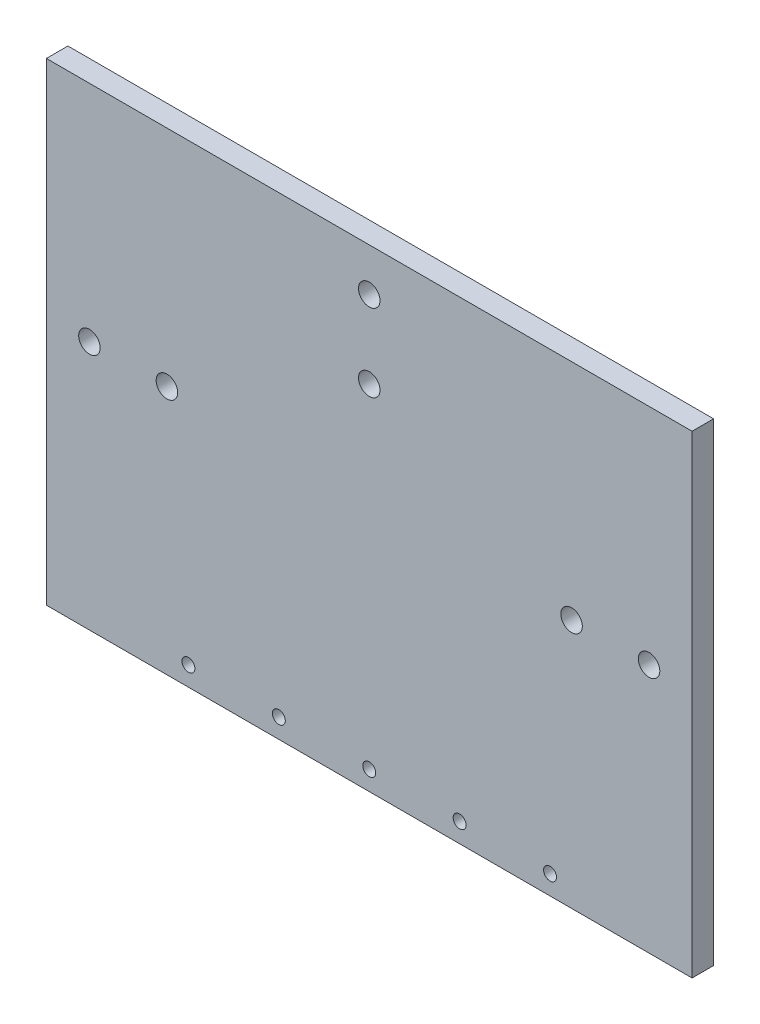
ISO-10303-21;
HEADER;
FILE_DESCRIPTION(('STEP AP214'),'2;1');
FILE_NAME('part.step','',(''),(''),'','','');
FILE_SCHEMA(('AUTOMOTIVE_DESIGN { 1 0 10303 214 1 1 1 1 }'));
ENDSEC;
DATA;
#1=APPLICATION_CONTEXT('core data for automotive mechanical design processes');
#2=APPLICATION_PROTOCOL_DEFINITION('international standard','automotive_design',2000,#1);
#3=PRODUCT_CONTEXT('',#1,'mechanical');
#4=PRODUCT('Part','Part','',(#3));
#5=PRODUCT_RELATED_PRODUCT_CATEGORY('part','',(#4));
#6=PRODUCT_DEFINITION_FORMATION('','',#4);
#7=PRODUCT_DEFINITION_CONTEXT('part definition',#1,'design');
#8=PRODUCT_DEFINITION('design','',#6,#7);
#9=PRODUCT_DEFINITION_SHAPE('','',#8);
#10=(LENGTH_UNIT() NAMED_UNIT(*) SI_UNIT(.MILLI.,.METRE.));
#11=(NAMED_UNIT(*) PLANE_ANGLE_UNIT() SI_UNIT($,.RADIAN.));
#12=(NAMED_UNIT(*) SI_UNIT($,.STERADIAN.) SOLID_ANGLE_UNIT());
#13=UNCERTAINTY_MEASURE_WITH_UNIT(LENGTH_MEASURE(1.E-05),#10,'distance_accuracy_value','');
#14=(GEOMETRIC_REPRESENTATION_CONTEXT(3) GLOBAL_UNCERTAINTY_ASSIGNED_CONTEXT((#13)) GLOBAL_UNIT_ASSIGNED_CONTEXT((#10,
#11,#12)) REPRESENTATION_CONTEXT('',''));
#15=CARTESIAN_POINT('',(0.,0.,0.));
#16=DIRECTION('',(0.,0.,1.));
#17=DIRECTION('',(1.,0.,0.));
#18=AXIS2_PLACEMENT_3D('',#15,#16,#17);
#19=CARTESIAN_POINT('',(-42.,-50.5,-0.00100000000000013));
#20=DIRECTION('',(0.,0.,1.));
#21=DIRECTION('',(1.,0.,0.));
#22=AXIS2_PLACEMENT_3D('',#19,#20,#21);
#23=CYLINDRICAL_SURFACE('',#22,1.5);
#24=CARTESIAN_POINT('',(-42.,-50.5,5.));
#25=DIRECTION('',(0.,0.,1.));
#26=DIRECTION('',(1.,0.,0.));
#27=AXIS2_PLACEMENT_3D('',#24,#25,#26);
#28=CIRCLE('',#27,1.5);
#29=CARTESIAN_POINT('',(-40.5,-50.5,5.));
#30=VERTEX_POINT('',#29);
#31=EDGE_CURVE('E46',#30,#30,#28,.T.);
#32=ORIENTED_EDGE('',*,*,#31,.T.);
#33=EDGE_LOOP('',(#32));
#34=FACE_BOUND('',#33,.T.);
#35=CARTESIAN_POINT('',(-42.,-50.5,0.));
#36=DIRECTION('',(0.,0.,1.));
#37=DIRECTION('',(1.,0.,0.));
#38=AXIS2_PLACEMENT_3D('',#35,#36,#37);
#39=CIRCLE('',#38,1.5);
#40=CARTESIAN_POINT('',(-40.5,-50.5,0.));
#41=VERTEX_POINT('',#40);
#42=EDGE_CURVE('E11',#41,#41,#39,.F.);
#43=ORIENTED_EDGE('',*,*,#42,.T.);
#44=EDGE_LOOP('',(#43));
#45=FACE_BOUND('',#44,.T.);
#46=ADVANCED_FACE('F38',(#34,#45),#23,.F.);
#47=CARTESIAN_POINT('',(-21.,-50.5,-0.00100000000000013));
#48=DIRECTION('',(0.,0.,1.));
#49=DIRECTION('',(1.,0.,0.));
#50=AXIS2_PLACEMENT_3D('',#47,#48,#49);
#51=CYLINDRICAL_SURFACE('',#50,1.5);
#52=CARTESIAN_POINT('',(-21.,-50.5,5.));
#53=DIRECTION('',(0.,0.,1.));
#54=DIRECTION('',(1.,0.,0.));
#55=AXIS2_PLACEMENT_3D('',#52,#53,#54);
#56=CIRCLE('',#55,1.5);
#57=CARTESIAN_POINT('',(-19.5,-50.5,5.));
#58=VERTEX_POINT('',#57);
#59=EDGE_CURVE('E122',#58,#58,#56,.T.);
#60=ORIENTED_EDGE('',*,*,#59,.T.);
#61=EDGE_LOOP('',(#60));
#62=FACE_BOUND('',#61,.T.);
#63=CARTESIAN_POINT('',(-21.,-50.5,0.));
#64=DIRECTION('',(0.,0.,1.));
#65=DIRECTION('',(1.,0.,0.));
#66=AXIS2_PLACEMENT_3D('',#63,#64,#65);
#67=CIRCLE('',#66,1.5);
#68=CARTESIAN_POINT('',(-19.5,-50.5,0.));
#69=VERTEX_POINT('',#68);
#70=EDGE_CURVE('E125',#69,#69,#67,.F.);
#71=ORIENTED_EDGE('',*,*,#70,.T.);
#72=EDGE_LOOP('',(#71));
#73=FACE_BOUND('',#72,.T.);
#74=ADVANCED_FACE('F149',(#62,#73),#51,.F.);
#75=CARTESIAN_POINT('',(0.,-50.5,-0.00100000000000013));
#76=DIRECTION('',(0.,0.,1.));
#77=DIRECTION('',(1.,0.,0.));
#78=AXIS2_PLACEMENT_3D('',#75,#76,#77);
#79=CYLINDRICAL_SURFACE('',#78,1.5);
#80=CARTESIAN_POINT('',(0.,-50.5,5.));
#81=DIRECTION('',(0.,0.,1.));
#82=DIRECTION('',(1.,0.,0.));
#83=AXIS2_PLACEMENT_3D('',#80,#81,#82);
#84=CIRCLE('',#83,1.5);
#85=CARTESIAN_POINT('',(1.50000000000001,-50.5,5.));
#86=VERTEX_POINT('',#85);
#87=EDGE_CURVE('E116',#86,#86,#84,.T.);
#88=ORIENTED_EDGE('',*,*,#87,.T.);
#89=EDGE_LOOP('',(#88));
#90=FACE_BOUND('',#89,.T.);
#91=CARTESIAN_POINT('',(0.,-50.5,0.));
#92=DIRECTION('',(0.,0.,1.));
#93=DIRECTION('',(1.,0.,0.));
#94=AXIS2_PLACEMENT_3D('',#91,#92,#93);
#95=CIRCLE('',#94,1.5);
#96=CARTESIAN_POINT('',(1.50000000000001,-50.5,0.));
#97=VERTEX_POINT('',#96);
#98=EDGE_CURVE('E119',#97,#97,#95,.F.);
#99=ORIENTED_EDGE('',*,*,#98,.T.);
#100=EDGE_LOOP('',(#99));
#101=FACE_BOUND('',#100,.T.);
#102=ADVANCED_FACE('F153',(#90,#101),#79,.F.);
#103=CARTESIAN_POINT('',(75.,55.,5.));
#104=DIRECTION('',(-1.,0.,0.));
#105=DIRECTION('',(0.,-1.,0.));
#106=AXIS2_PLACEMENT_3D('',#103,#104,#105);
#107=PLANE('',#106);
#108=DIRECTION('',(0.,1.,0.));
#109=VECTOR('',#108,1.);
#110=CARTESIAN_POINT('',(75.,55.,0.));
#111=LINE('',#110,#109);
#112=CARTESIAN_POINT('',(75.,-55.,0.));
#113=VERTEX_POINT('',#112);
#114=CARTESIAN_POINT('',(75.,55.,0.));
#115=VERTEX_POINT('',#114);
#116=EDGE_CURVE('E106',#113,#115,#111,.T.);
#117=ORIENTED_EDGE('',*,*,#116,.T.);
#118=DIRECTION('',(0.,0.,-1.));
#119=VECTOR('',#118,1.);
#120=CARTESIAN_POINT('',(75.,55.,5.));
#121=LINE('',#120,#119);
#122=CARTESIAN_POINT('',(75.,55.,5.));
#123=VERTEX_POINT('',#122);
#124=EDGE_CURVE('E97',#123,#115,#121,.T.);
#125=ORIENTED_EDGE('',*,*,#124,.F.);
#126=DIRECTION('',(0.,1.,0.));
#127=VECTOR('',#126,1.);
#128=CARTESIAN_POINT('',(75.,55.,5.));
#129=LINE('',#128,#127);
#130=CARTESIAN_POINT('',(75.,-55.,5.));
#131=VERTEX_POINT('',#130);
#132=EDGE_CURVE('E91',#131,#123,#129,.T.);
#133=ORIENTED_EDGE('',*,*,#132,.F.);
#134=DIRECTION('',(0.,0.,-1.));
#135=VECTOR('',#134,1.);
#136=CARTESIAN_POINT('',(75.,-55.,5.));
#137=LINE('',#136,#135);
#138=EDGE_CURVE('E102',#131,#113,#137,.T.);
#139=ORIENTED_EDGE('',*,*,#138,.T.);
#140=EDGE_LOOP('',(#117,#125,#133,#139));
#141=FACE_BOUND('',#140,.T.);
#142=ADVANCED_FACE('F158',(#141),#107,.F.);
#143=CARTESIAN_POINT('',(-75.,55.,5.));
#144=DIRECTION('',(0.,-1.,0.));
#145=DIRECTION('',(0.,0.,-1.));
#146=AXIS2_PLACEMENT_3D('',#143,#144,#145);
#147=PLANE('',#146);
#148=DIRECTION('',(-1.,0.,0.));
#149=VECTOR('',#148,1.);
#150=CARTESIAN_POINT('',(-75.,55.,0.));
#151=LINE('',#150,#149);
#152=CARTESIAN_POINT('',(-75.,55.,0.));
#153=VERTEX_POINT('',#152);
#154=EDGE_CURVE('E96',#115,#153,#151,.T.);
#155=ORIENTED_EDGE('',*,*,#154,.T.);
#156=DIRECTION('',(0.,0.,-1.));
#157=VECTOR('',#156,1.);
#158=CARTESIAN_POINT('',(-75.,55.,5.));
#159=LINE('',#158,#157);
#160=CARTESIAN_POINT('',(-75.,55.,5.));
#161=VERTEX_POINT('',#160);
#162=EDGE_CURVE('E94',#161,#153,#159,.T.);
#163=ORIENTED_EDGE('',*,*,#162,.F.);
#164=DIRECTION('',(-1.,0.,0.));
#165=VECTOR('',#164,1.);
#166=CARTESIAN_POINT('',(-75.,55.,5.));
#167=LINE('',#166,#165);
#168=EDGE_CURVE('E85',#123,#161,#167,.T.);
#169=ORIENTED_EDGE('',*,*,#168,.F.);
#170=ORIENTED_EDGE('',*,*,#124,.T.);
#171=EDGE_LOOP('',(#155,#163,#169,#170));
#172=FACE_BOUND('',#171,.T.);
#173=ADVANCED_FACE('F95',(#172),#147,.F.);
#174=CARTESIAN_POINT('',(-75.,55.,5.));
#175=DIRECTION('',(1.,0.,0.));
#176=DIRECTION('',(0.,1.,0.));
#177=AXIS2_PLACEMENT_3D('',#174,#175,#176);
#178=PLANE('',#177);
#179=DIRECTION('',(0.,-1.,0.));
#180=VECTOR('',#179,1.);
#181=CARTESIAN_POINT('',(-75.,55.,0.));
#182=LINE('',#181,#180);
#183=CARTESIAN_POINT('',(-75.,-55.,0.));
#184=VERTEX_POINT('',#183);
#185=EDGE_CURVE('E71',#153,#184,#182,.T.);
#186=ORIENTED_EDGE('',*,*,#185,.T.);
#187=DIRECTION('',(0.,0.,-1.));
#188=VECTOR('',#187,1.);
#189=CARTESIAN_POINT('',(-75.,-55.,5.));
#190=LINE('',#189,#188);
#191=CARTESIAN_POINT('',(-75.,-55.,5.));
#192=VERTEX_POINT('',#191);
#193=EDGE_CURVE('E98',#192,#184,#190,.T.);
#194=ORIENTED_EDGE('',*,*,#193,.F.);
#195=DIRECTION('',(0.,-1.,0.));
#196=VECTOR('',#195,1.);
#197=CARTESIAN_POINT('',(-75.,55.,5.));
#198=LINE('',#197,#196);
#199=EDGE_CURVE('E89',#161,#192,#198,.T.);
#200=ORIENTED_EDGE('',*,*,#199,.F.);
#201=ORIENTED_EDGE('',*,*,#162,.T.);
#202=EDGE_LOOP('',(#186,#194,#200,#201));
#203=FACE_BOUND('',#202,.T.);
#204=ADVANCED_FACE('F100',(#203),#178,.F.);
#205=CARTESIAN_POINT('',(-75.,-55.,5.));
#206=DIRECTION('',(0.,1.,0.));
#207=DIRECTION('',(0.,0.,1.));
#208=AXIS2_PLACEMENT_3D('',#205,#206,#207);
#209=PLANE('',#208);
#210=DIRECTION('',(1.,0.,0.));
#211=VECTOR('',#210,1.);
#212=CARTESIAN_POINT('',(-75.,-55.,0.));
#213=LINE('',#212,#211);
#214=EDGE_CURVE('E77',#184,#113,#213,.T.);
#215=ORIENTED_EDGE('',*,*,#214,.T.);
#216=ORIENTED_EDGE('',*,*,#138,.F.);
#217=DIRECTION('',(1.,0.,0.));
#218=VECTOR('',#217,1.);
#219=CARTESIAN_POINT('',(-75.,-55.,5.));
#220=LINE('',#219,#218);
#221=EDGE_CURVE('E54',#192,#131,#220,.T.);
#222=ORIENTED_EDGE('',*,*,#221,.F.);
#223=ORIENTED_EDGE('',*,*,#193,.T.);
#224=EDGE_LOOP('',(#215,#216,#222,#223));
#225=FACE_BOUND('',#224,.T.);
#226=ADVANCED_FACE('F134',(#225),#209,.F.);
#227=CARTESIAN_POINT('',(0.,0.,5.));
#228=DIRECTION('',(0.,0.,1.));
#229=DIRECTION('',(1.,0.,0.));
#230=AXIS2_PLACEMENT_3D('',#227,#228,#229);
#231=PLANE('',#230);
#232=CARTESIAN_POINT('',(0.,45.,5.));
#233=DIRECTION('',(0.,0.,1.));
#234=DIRECTION('',(1.,0.,0.));
#235=AXIS2_PLACEMENT_3D('',#232,#233,#234);
#236=CIRCLE('',#235,2.5);
#237=CARTESIAN_POINT('',(2.5,45.,5.));
#238=VERTEX_POINT('',#237);
#239=EDGE_CURVE('E285',#238,#238,#236,.T.);
#240=ORIENTED_EDGE('',*,*,#239,.F.);
#241=EDGE_LOOP('',(#240));
#242=FACE_BOUND('',#241,.T.);
#243=CARTESIAN_POINT('',(0.,27.,5.));
#244=DIRECTION('',(0.,0.,1.));
#245=DIRECTION('',(1.,0.,0.));
#246=AXIS2_PLACEMENT_3D('',#243,#244,#245);
#247=CIRCLE('',#246,2.5);
#248=CARTESIAN_POINT('',(2.5,27.,5.));
#249=VERTEX_POINT('',#248);
#250=EDGE_CURVE('E297',#249,#249,#247,.T.);
#251=ORIENTED_EDGE('',*,*,#250,.F.);
#252=EDGE_LOOP('',(#251));
#253=FACE_BOUND('',#252,.T.);
#254=CARTESIAN_POINT('',(65.,3.,5.));
#255=DIRECTION('',(0.,0.,-1.));
#256=DIRECTION('',(-1.,0.,0.));
#257=AXIS2_PLACEMENT_3D('',#254,#255,#256);
#258=CIRCLE('',#257,2.5);
#259=CARTESIAN_POINT('',(62.5,3.,5.));
#260=VERTEX_POINT('',#259);
#261=EDGE_CURVE('E302',#260,#260,#258,.T.);
#262=ORIENTED_EDGE('',*,*,#261,.T.);
#263=EDGE_LOOP('',(#262));
#264=FACE_BOUND('',#263,.T.);
#265=CARTESIAN_POINT('',(47.,3.00000000000001,5.));
#266=DIRECTION('',(0.,0.,-1.));
#267=DIRECTION('',(-1.,0.,0.));
#268=AXIS2_PLACEMENT_3D('',#265,#266,#267);
#269=CIRCLE('',#268,2.5);
#270=CARTESIAN_POINT('',(44.5,3.00000000000001,5.));
#271=VERTEX_POINT('',#270);
#272=EDGE_CURVE('E292',#271,#271,#269,.T.);
#273=ORIENTED_EDGE('',*,*,#272,.T.);
#274=EDGE_LOOP('',(#273));
#275=FACE_BOUND('',#274,.T.);
#276=CARTESIAN_POINT('',(-65.,3.,5.));
#277=DIRECTION('',(0.,0.,1.));
#278=DIRECTION('',(1.,0.,0.));
#279=AXIS2_PLACEMENT_3D('',#276,#277,#278);
#280=CIRCLE('',#279,2.5);
#281=CARTESIAN_POINT('',(-62.5,3.,5.));
#282=VERTEX_POINT('',#281);
#283=EDGE_CURVE('E311',#282,#282,#280,.T.);
#284=ORIENTED_EDGE('',*,*,#283,.F.);
#285=EDGE_LOOP('',(#284));
#286=FACE_BOUND('',#285,.T.);
#287=CARTESIAN_POINT('',(-47.,3.00000000000001,5.));
#288=DIRECTION('',(0.,0.,1.));
#289=DIRECTION('',(1.,0.,0.));
#290=AXIS2_PLACEMENT_3D('',#287,#288,#289);
#291=CIRCLE('',#290,2.5);
#292=CARTESIAN_POINT('',(-44.5,3.00000000000001,5.));
#293=VERTEX_POINT('',#292);
#294=EDGE_CURVE('E305',#293,#293,#291,.T.);
#295=ORIENTED_EDGE('',*,*,#294,.F.);
#296=EDGE_LOOP('',(#295));
#297=FACE_BOUND('',#296,.T.);
#298=CARTESIAN_POINT('',(21.,-50.5,5.));
#299=DIRECTION('',(0.,0.,1.));
#300=DIRECTION('',(1.,0.,0.));
#301=AXIS2_PLACEMENT_3D('',#298,#299,#300);
#302=CIRCLE('',#301,1.5);
#303=CARTESIAN_POINT('',(22.5,-50.5,5.));
#304=VERTEX_POINT('',#303);
#305=EDGE_CURVE('E318',#304,#304,#302,.T.);
#306=ORIENTED_EDGE('',*,*,#305,.F.);
#307=EDGE_LOOP('',(#306));
#308=FACE_BOUND('',#307,.T.);
#309=CARTESIAN_POINT('',(42.,-50.5,5.));
#310=DIRECTION('',(0.,0.,1.));
#311=DIRECTION('',(1.,0.,0.));
#312=AXIS2_PLACEMENT_3D('',#309,#310,#311);
#313=CIRCLE('',#312,1.5);
#314=CARTESIAN_POINT('',(43.5,-50.5,5.));
#315=VERTEX_POINT('',#314);
#316=EDGE_CURVE('E328',#315,#315,#313,.T.);
#317=ORIENTED_EDGE('',*,*,#316,.F.);
#318=EDGE_LOOP('',(#317));
#319=FACE_BOUND('',#318,.T.);
#320=ORIENTED_EDGE('',*,*,#132,.T.);
#321=ORIENTED_EDGE('',*,*,#168,.T.);
#322=ORIENTED_EDGE('',*,*,#199,.T.);
#323=ORIENTED_EDGE('',*,*,#221,.T.);
#324=EDGE_LOOP('',(#320,#321,#322,#323));
#325=FACE_BOUND('',#324,.T.);
#326=ORIENTED_EDGE('',*,*,#87,.F.);
#327=EDGE_LOOP('',(#326));
#328=FACE_BOUND('',#327,.T.);
#329=ORIENTED_EDGE('',*,*,#59,.F.);
#330=EDGE_LOOP('',(#329));
#331=FACE_BOUND('',#330,.T.);
#332=ORIENTED_EDGE('',*,*,#31,.F.);
#333=EDGE_LOOP('',(#332));
#334=FACE_BOUND('',#333,.T.);
#335=ADVANCED_FACE('F86',(#242,#253,#264,#275,#286,#297,#308,#319,#325,#328,#331,#334),#231,.T.);
#336=CARTESIAN_POINT('',(0.,0.,0.));
#337=DIRECTION('',(0.,0.,1.));
#338=DIRECTION('',(1.,0.,0.));
#339=AXIS2_PLACEMENT_3D('',#336,#337,#338);
#340=PLANE('',#339);
#341=CARTESIAN_POINT('',(0.,45.,0.));
#342=DIRECTION('',(0.,0.,1.));
#343=DIRECTION('',(1.,0.,0.));
#344=AXIS2_PLACEMENT_3D('',#341,#342,#343);
#345=CIRCLE('',#344,2.5);
#346=CARTESIAN_POINT('',(2.5,45.,0.));
#347=VERTEX_POINT('',#346);
#348=EDGE_CURVE('E288',#347,#347,#345,.F.);
#349=ORIENTED_EDGE('',*,*,#348,.F.);
#350=EDGE_LOOP('',(#349));
#351=FACE_BOUND('',#350,.T.);
#352=CARTESIAN_POINT('',(0.,27.,0.));
#353=DIRECTION('',(0.,0.,1.));
#354=DIRECTION('',(1.,0.,0.));
#355=AXIS2_PLACEMENT_3D('',#352,#353,#354);
#356=CIRCLE('',#355,2.5);
#357=CARTESIAN_POINT('',(2.5,27.,0.));
#358=VERTEX_POINT('',#357);
#359=EDGE_CURVE('E294',#358,#358,#356,.F.);
#360=ORIENTED_EDGE('',*,*,#359,.F.);
#361=EDGE_LOOP('',(#360));
#362=FACE_BOUND('',#361,.T.);
#363=CARTESIAN_POINT('',(65.,3.,0.));
#364=DIRECTION('',(0.,0.,1.));
#365=DIRECTION('',(1.,0.,0.));
#366=AXIS2_PLACEMENT_3D('',#363,#364,#365);
#367=CIRCLE('',#366,2.5);
#368=CARTESIAN_POINT('',(67.5,3.,0.));
#369=VERTEX_POINT('',#368);
#370=EDGE_CURVE('E306',#369,#369,#367,.T.);
#371=ORIENTED_EDGE('',*,*,#370,.T.);
#372=EDGE_LOOP('',(#371));
#373=FACE_BOUND('',#372,.T.);
#374=CARTESIAN_POINT('',(47.,3.00000000000001,0.));
#375=DIRECTION('',(0.,0.,1.));
#376=DIRECTION('',(1.,0.,0.));
#377=AXIS2_PLACEMENT_3D('',#374,#375,#376);
#378=CIRCLE('',#377,2.5);
#379=CARTESIAN_POINT('',(49.5,3.00000000000001,0.));
#380=VERTEX_POINT('',#379);
#381=EDGE_CURVE('E289',#380,#380,#378,.T.);
#382=ORIENTED_EDGE('',*,*,#381,.T.);
#383=EDGE_LOOP('',(#382));
#384=FACE_BOUND('',#383,.T.);
#385=CARTESIAN_POINT('',(-65.,3.,0.));
#386=DIRECTION('',(0.,0.,1.));
#387=DIRECTION('',(1.,0.,0.));
#388=AXIS2_PLACEMENT_3D('',#385,#386,#387);
#389=CIRCLE('',#388,2.5);
#390=CARTESIAN_POINT('',(-62.5,3.,0.));
#391=VERTEX_POINT('',#390);
#392=EDGE_CURVE('E314',#391,#391,#389,.F.);
#393=ORIENTED_EDGE('',*,*,#392,.F.);
#394=EDGE_LOOP('',(#393));
#395=FACE_BOUND('',#394,.T.);
#396=CARTESIAN_POINT('',(-47.,3.00000000000001,0.));
#397=DIRECTION('',(0.,0.,1.));
#398=DIRECTION('',(1.,0.,0.));
#399=AXIS2_PLACEMENT_3D('',#396,#397,#398);
#400=CIRCLE('',#399,2.5);
#401=CARTESIAN_POINT('',(-44.5,3.00000000000001,0.));
#402=VERTEX_POINT('',#401);
#403=EDGE_CURVE('E315',#402,#402,#400,.F.);
#404=ORIENTED_EDGE('',*,*,#403,.F.);
#405=EDGE_LOOP('',(#404));
#406=FACE_BOUND('',#405,.T.);
#407=CARTESIAN_POINT('',(21.,-50.5,0.));
#408=DIRECTION('',(0.,0.,1.));
#409=DIRECTION('',(1.,0.,0.));
#410=AXIS2_PLACEMENT_3D('',#407,#408,#409);
#411=CIRCLE('',#410,1.5);
#412=CARTESIAN_POINT('',(22.5,-50.5,0.));
#413=VERTEX_POINT('',#412);
#414=EDGE_CURVE('E325',#413,#413,#411,.F.);
#415=ORIENTED_EDGE('',*,*,#414,.F.);
#416=EDGE_LOOP('',(#415));
#417=FACE_BOUND('',#416,.T.);
#418=CARTESIAN_POINT('',(42.,-50.5,0.));
#419=DIRECTION('',(0.,0.,1.));
#420=DIRECTION('',(1.,0.,0.));
#421=AXIS2_PLACEMENT_3D('',#418,#419,#420);
#422=CIRCLE('',#421,1.5);
#423=CARTESIAN_POINT('',(43.5,-50.5,0.));
#424=VERTEX_POINT('',#423);
#425=EDGE_CURVE('E109',#424,#424,#422,.F.);
#426=ORIENTED_EDGE('',*,*,#425,.F.);
#427=EDGE_LOOP('',(#426));
#428=FACE_BOUND('',#427,.T.);
#429=ORIENTED_EDGE('',*,*,#116,.F.);
#430=ORIENTED_EDGE('',*,*,#214,.F.);
#431=ORIENTED_EDGE('',*,*,#185,.F.);
#432=ORIENTED_EDGE('',*,*,#154,.F.);
#433=EDGE_LOOP('',(#429,#430,#431,#432));
#434=FACE_BOUND('',#433,.T.);
#435=ORIENTED_EDGE('',*,*,#98,.F.);
#436=EDGE_LOOP('',(#435));
#437=FACE_BOUND('',#436,.T.);
#438=ORIENTED_EDGE('',*,*,#70,.F.);
#439=EDGE_LOOP('',(#438));
#440=FACE_BOUND('',#439,.T.);
#441=ORIENTED_EDGE('',*,*,#42,.F.);
#442=EDGE_LOOP('',(#441));
#443=FACE_BOUND('',#442,.T.);
#444=ADVANCED_FACE('F133',(#351,#362,#373,#384,#395,#406,#417,#428,#434,#437,#440,#443),#340,.F.);
#445=CARTESIAN_POINT('',(42.,-50.5,-0.00100000000000013));
#446=DIRECTION('',(0.,0.,1.));
#447=DIRECTION('',(1.,0.,0.));
#448=AXIS2_PLACEMENT_3D('',#445,#446,#447);
#449=CYLINDRICAL_SURFACE('',#448,1.5);
#450=ORIENTED_EDGE('',*,*,#316,.T.);
#451=EDGE_LOOP('',(#450));
#452=FACE_BOUND('',#451,.T.);
#453=ORIENTED_EDGE('',*,*,#425,.T.);
#454=EDGE_LOOP('',(#453));
#455=FACE_BOUND('',#454,.T.);
#456=ADVANCED_FACE('F141',(#452,#455),#449,.F.);
#457=CARTESIAN_POINT('',(21.,-50.5,-0.00100000000000013));
#458=DIRECTION('',(0.,0.,1.));
#459=DIRECTION('',(1.,0.,0.));
#460=AXIS2_PLACEMENT_3D('',#457,#458,#459);
#461=CYLINDRICAL_SURFACE('',#460,1.5);
#462=ORIENTED_EDGE('',*,*,#305,.T.);
#463=EDGE_LOOP('',(#462));
#464=FACE_BOUND('',#463,.T.);
#465=ORIENTED_EDGE('',*,*,#414,.T.);
#466=EDGE_LOOP('',(#465));
#467=FACE_BOUND('',#466,.T.);
#468=ADVANCED_FACE('F186',(#464,#467),#461,.F.);
#469=CARTESIAN_POINT('',(-47.,3.00000000000001,-0.00100000000000013));
#470=DIRECTION('',(0.,0.,1.));
#471=DIRECTION('',(1.,0.,0.));
#472=AXIS2_PLACEMENT_3D('',#469,#470,#471);
#473=CYLINDRICAL_SURFACE('',#472,2.5);
#474=ORIENTED_EDGE('',*,*,#294,.T.);
#475=EDGE_LOOP('',(#474));
#476=FACE_BOUND('',#475,.T.);
#477=ORIENTED_EDGE('',*,*,#403,.T.);
#478=EDGE_LOOP('',(#477));
#479=FACE_BOUND('',#478,.T.);
#480=ADVANCED_FACE('F211',(#476,#479),#473,.F.);
#481=CARTESIAN_POINT('',(-65.,3.,-0.00100000000000013));
#482=DIRECTION('',(0.,0.,1.));
#483=DIRECTION('',(1.,0.,0.));
#484=AXIS2_PLACEMENT_3D('',#481,#482,#483);
#485=CYLINDRICAL_SURFACE('',#484,2.5);
#486=ORIENTED_EDGE('',*,*,#283,.T.);
#487=EDGE_LOOP('',(#486));
#488=FACE_BOUND('',#487,.T.);
#489=ORIENTED_EDGE('',*,*,#392,.T.);
#490=EDGE_LOOP('',(#489));
#491=FACE_BOUND('',#490,.T.);
#492=ADVANCED_FACE('F221',(#488,#491),#485,.F.);
#493=CARTESIAN_POINT('',(47.,3.00000000000001,-0.00100000000000013));
#494=DIRECTION('',(0.,0.,1.));
#495=DIRECTION('',(1.,0.,0.));
#496=AXIS2_PLACEMENT_3D('',#493,#494,#495);
#497=CYLINDRICAL_SURFACE('',#496,2.5);
#498=ORIENTED_EDGE('',*,*,#272,.F.);
#499=EDGE_LOOP('',(#498));
#500=FACE_BOUND('',#499,.T.);
#501=ORIENTED_EDGE('',*,*,#381,.F.);
#502=EDGE_LOOP('',(#501));
#503=FACE_BOUND('',#502,.T.);
#504=ADVANCED_FACE('F231',(#500,#503),#497,.F.);
#505=CARTESIAN_POINT('',(65.,3.,-0.00100000000000013));
#506=DIRECTION('',(0.,0.,1.));
#507=DIRECTION('',(1.,0.,0.));
#508=AXIS2_PLACEMENT_3D('',#505,#506,#507);
#509=CYLINDRICAL_SURFACE('',#508,2.5);
#510=ORIENTED_EDGE('',*,*,#261,.F.);
#511=EDGE_LOOP('',(#510));
#512=FACE_BOUND('',#511,.T.);
#513=ORIENTED_EDGE('',*,*,#370,.F.);
#514=EDGE_LOOP('',(#513));
#515=FACE_BOUND('',#514,.T.);
#516=ADVANCED_FACE('F241',(#512,#515),#509,.F.);
#517=CARTESIAN_POINT('',(0.,27.,-0.00100000000000013));
#518=DIRECTION('',(0.,0.,1.));
#519=DIRECTION('',(1.,0.,0.));
#520=AXIS2_PLACEMENT_3D('',#517,#518,#519);
#521=CYLINDRICAL_SURFACE('',#520,2.5);
#522=ORIENTED_EDGE('',*,*,#250,.T.);
#523=EDGE_LOOP('',(#522));
#524=FACE_BOUND('',#523,.T.);
#525=ORIENTED_EDGE('',*,*,#359,.T.);
#526=EDGE_LOOP('',(#525));
#527=FACE_BOUND('',#526,.T.);
#528=ADVANCED_FACE('F250',(#524,#527),#521,.F.);
#529=CARTESIAN_POINT('',(0.,45.,-0.00100000000000013));
#530=DIRECTION('',(0.,0.,1.));
#531=DIRECTION('',(1.,0.,0.));
#532=AXIS2_PLACEMENT_3D('',#529,#530,#531);
#533=CYLINDRICAL_SURFACE('',#532,2.5);
#534=ORIENTED_EDGE('',*,*,#239,.T.);
#535=EDGE_LOOP('',(#534));
#536=FACE_BOUND('',#535,.T.);
#537=ORIENTED_EDGE('',*,*,#348,.T.);
#538=EDGE_LOOP('',(#537));
#539=FACE_BOUND('',#538,.T.);
#540=ADVANCED_FACE('F269',(#536,#539),#533,.F.);
#541=CLOSED_SHELL('',(#46,#74,#102,#142,#173,#204,#226,#335,#444,#456,#468,#480,#492,#504,#516,
#528,#540));
#542=MANIFOLD_SOLID_BREP('B2',#541);
#543=ADVANCED_BREP_SHAPE_REPRESENTATION('',(#18,#542),#14);
#544=SHAPE_DEFINITION_REPRESENTATION(#9,#543);
ENDSEC;
END-ISO-10303-21;
